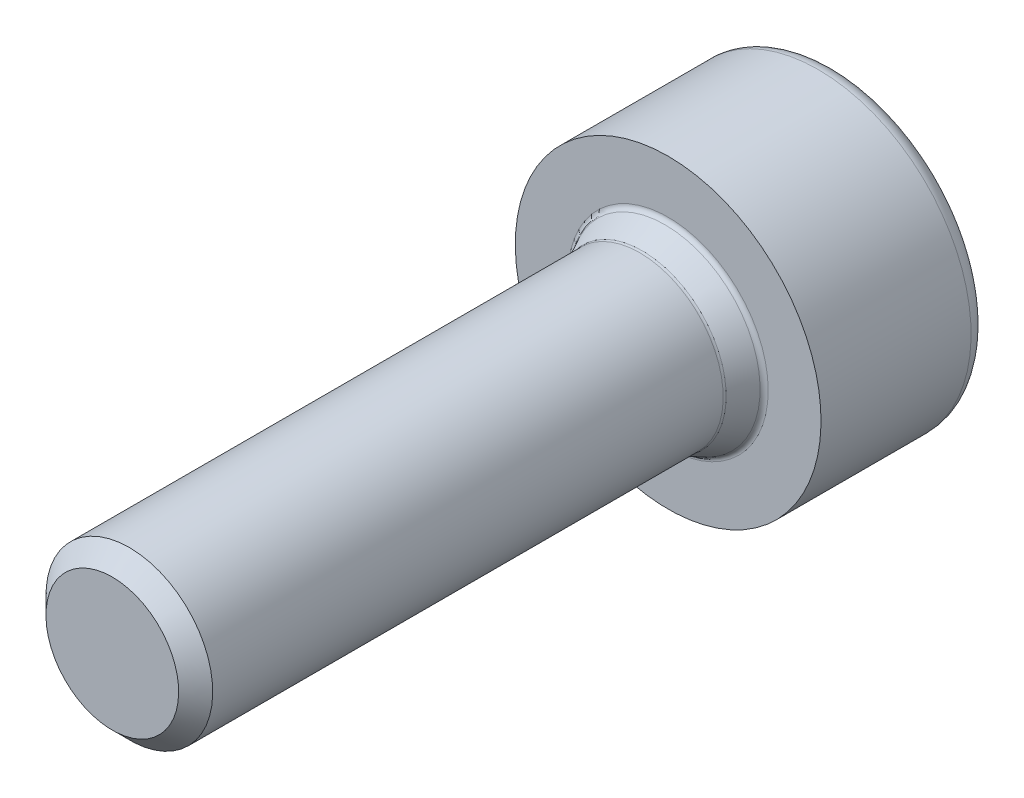
ISO-10303-21;
HEADER;
FILE_DESCRIPTION(('STEP AP214'),'2;1');
FILE_NAME('part.step','',(''),(''),'','','');
FILE_SCHEMA(('AUTOMOTIVE_DESIGN { 1 0 10303 214 1 1 1 1 }'));
ENDSEC;
DATA;
#1=APPLICATION_CONTEXT('core data for automotive mechanical design processes');
#2=APPLICATION_PROTOCOL_DEFINITION('international standard','automotive_design',2000,#1);
#3=PRODUCT_CONTEXT('',#1,'mechanical');
#4=PRODUCT('Part','Part','',(#3));
#5=PRODUCT_RELATED_PRODUCT_CATEGORY('part','',(#4));
#6=PRODUCT_DEFINITION_FORMATION('','',#4);
#7=PRODUCT_DEFINITION_CONTEXT('part definition',#1,'design');
#8=PRODUCT_DEFINITION('design','',#6,#7);
#9=PRODUCT_DEFINITION_SHAPE('','',#8);
#10=(LENGTH_UNIT() NAMED_UNIT(*) SI_UNIT(.MILLI.,.METRE.));
#11=(NAMED_UNIT(*) PLANE_ANGLE_UNIT() SI_UNIT($,.RADIAN.));
#12=(NAMED_UNIT(*) SI_UNIT($,.STERADIAN.) SOLID_ANGLE_UNIT());
#13=UNCERTAINTY_MEASURE_WITH_UNIT(LENGTH_MEASURE(1.E-05),#10,'distance_accuracy_value','');
#14=(GEOMETRIC_REPRESENTATION_CONTEXT(3) GLOBAL_UNCERTAINTY_ASSIGNED_CONTEXT((#13)) GLOBAL_UNIT_ASSIGNED_CONTEXT((#10,
#11,#12)) REPRESENTATION_CONTEXT('',''));
#15=CARTESIAN_POINT('',(0.,0.,0.));
#16=DIRECTION('',(0.,0.,1.));
#17=DIRECTION('',(1.,0.,0.));
#18=AXIS2_PLACEMENT_3D('',#15,#16,#17);
#19=CARTESIAN_POINT('',(-275.09203088991,679.314830971587,-405.507743681072));
#20=DIRECTION('',(0.,0.,1.));
#21=DIRECTION('',(1.,0.,0.));
#22=AXIS2_PLACEMENT_3D('',#19,#20,#21);
#23=PLANE('',#22);
#24=DIRECTION('',(0.,1.,0.));
#25=VECTOR('',#24,1.);
#26=CARTESIAN_POINT('',(-273.84203088991,678.5931431351,-405.507743681072));
#27=LINE('',#26,#25);
#28=CARTESIAN_POINT('',(-273.842030890129,679.314830971587,-405.507743681448));
#29=VERTEX_POINT('',#28);
#30=CARTESIAN_POINT('',(-273.84203088991,678.5931431351,-405.507743681072));
#31=VERTEX_POINT('',#30);
#32=EDGE_CURVE('E162',#29,#31,#27,.F.);
#33=ORIENTED_EDGE('',*,*,#32,.T.);
#34=DIRECTION('',(0.866025403784439,0.499999999999999,0.));
#35=VECTOR('',#34,1.);
#36=CARTESIAN_POINT('',(-275.09203088991,677.871455298613,-405.507743681072));
#37=LINE('',#36,#35);
#38=CARTESIAN_POINT('',(-274.467030890019,678.232299217046,-405.507743681448));
#39=VERTEX_POINT('',#38);
#40=EDGE_CURVE('E158',#31,#39,#37,.F.);
#41=ORIENTED_EDGE('',*,*,#40,.T.);
#42=CARTESIAN_POINT('',(-275.09203088991,679.314830971587,-405.507743681824));
#43=DIRECTION('',(0.,-1.99840144502376E-13,-1.));
#44=DIRECTION('',(0.,1.,-1.99840144502376E-13));
#45=AXIS2_PLACEMENT_3D('',#42,#43,#44);
#46=CIRCLE('',#45,1.24999999956307);
#47=EDGE_CURVE('E159',#39,#29,#46,.F.);
#48=ORIENTED_EDGE('',*,*,#47,.T.);
#49=EDGE_LOOP('',(#33,#41,#48));
#50=FACE_BOUND('',#49,.T.);
#51=ADVANCED_FACE('F17',(#50),#23,.F.);
#52=CARTESIAN_POINT('',(-275.09203088991,679.314830971587,-405.507743681072));
#53=DIRECTION('',(0.,0.,1.));
#54=DIRECTION('',(1.,0.,0.));
#55=AXIS2_PLACEMENT_3D('',#52,#53,#54);
#56=PLANE('',#55);
#57=DIRECTION('',(-0.866025403784438,0.500000000000001,0.));
#58=VECTOR('',#57,1.);
#59=CARTESIAN_POINT('',(-273.84203088991,680.036518808074,-405.507743681072));
#60=LINE('',#59,#58);
#61=CARTESIAN_POINT('',(-274.467030890019,680.397362726128,-405.507743681448));
#62=VERTEX_POINT('',#61);
#63=CARTESIAN_POINT('',(-273.84203088991,680.036518808074,-405.507743681072));
#64=VERTEX_POINT('',#63);
#65=EDGE_CURVE('E526',#62,#64,#60,.F.);
#66=ORIENTED_EDGE('',*,*,#65,.T.);
#67=DIRECTION('',(0.,1.,0.));
#68=VECTOR('',#67,1.);
#69=CARTESIAN_POINT('',(-273.84203088991,678.5931431351,-405.507743681072));
#70=LINE('',#69,#68);
#71=EDGE_CURVE('E554',#64,#29,#70,.F.);
#72=ORIENTED_EDGE('',*,*,#71,.T.);
#73=CARTESIAN_POINT('',(-275.09203088991,679.314830971587,-405.507743681824));
#74=DIRECTION('',(0.,-1.99840144502376E-13,-1.));
#75=DIRECTION('',(0.,1.,-1.99840144502376E-13));
#76=AXIS2_PLACEMENT_3D('',#73,#74,#75);
#77=CIRCLE('',#76,1.24999999956316);
#78=EDGE_CURVE('E177',#62,#29,#77,.T.);
#79=ORIENTED_EDGE('',*,*,#78,.F.);
#80=EDGE_LOOP('',(#66,#72,#79));
#81=FACE_BOUND('',#80,.T.);
#82=ADVANCED_FACE('F752',(#81),#56,.F.);
#83=CARTESIAN_POINT('',(-273.84203088991,678.5931431351,-405.507743681072));
#84=DIRECTION('',(1.,0.,0.));
#85=DIRECTION('',(0.,0.,-1.));
#86=AXIS2_PLACEMENT_3D('',#83,#84,#85);
#87=PLANE('',#86);
#88=DIRECTION('',(0.,1.,0.));
#89=VECTOR('',#88,1.);
#90=CARTESIAN_POINT('',(-273.84203088991,678.5931431351,-407.357743681072));
#91=LINE('',#90,#89);
#92=CARTESIAN_POINT('',(-273.84203088991,678.5931431351,-407.357743681072));
#93=VERTEX_POINT('',#92);
#94=CARTESIAN_POINT('',(-273.84203088991,678.610043769767,-407.35774368113));
#95=VERTEX_POINT('',#94);
#96=EDGE_CURVE('E426',#93,#95,#91,.T.);
#97=ORIENTED_EDGE('',*,*,#96,.F.);
#98=DIRECTION('',(0.,0.,1.));
#99=VECTOR('',#98,1.);
#100=CARTESIAN_POINT('',(-273.84203088991,678.5931431351,-405.507743681072));
#101=LINE('',#100,#99);
#102=EDGE_CURVE('E167',#93,#31,#101,.T.);
#103=ORIENTED_EDGE('',*,*,#102,.T.);
#104=ORIENTED_EDGE('',*,*,#32,.F.);
#105=ORIENTED_EDGE('',*,*,#71,.F.);
#106=DIRECTION('',(0.,0.,1.));
#107=VECTOR('',#106,1.);
#108=CARTESIAN_POINT('',(-273.84203088991,680.036518808074,-405.507743681072));
#109=LINE('',#108,#107);
#110=CARTESIAN_POINT('',(-273.84203088991,680.036518808074,-407.357743681072));
#111=VERTEX_POINT('',#110);
#112=EDGE_CURVE('E516',#64,#111,#109,.F.);
#113=ORIENTED_EDGE('',*,*,#112,.T.);
#114=DIRECTION('',(0.,1.,0.));
#115=VECTOR('',#114,1.);
#116=CARTESIAN_POINT('',(-273.84203088991,678.5931431351,-407.357743681072));
#117=LINE('',#116,#115);
#118=CARTESIAN_POINT('',(-273.84203088991,680.019618173502,-407.357743681177));
#119=VERTEX_POINT('',#118);
#120=EDGE_CURVE('E180',#119,#111,#117,.T.);
#121=ORIENTED_EDGE('',*,*,#120,.F.);
#122=CARTESIAN_POINT('',(-273.842030889891,678.61004376969,-407.357743681158));
#123=CARTESIAN_POINT('',(-273.842030889903,678.658367351189,-407.334028895814));
#124=CARTESIAN_POINT('',(-273.842030889908,678.707484359012,-407.311738212772));
#125=CARTESIAN_POINT('',(-273.842030889912,678.807601912463,-407.270951862234));
#126=CARTESIAN_POINT('',(-273.842030889911,678.858612037213,-407.252479912255));
#127=CARTESIAN_POINT('',(-273.842030889909,678.962032609969,-407.220650670239));
#128=CARTESIAN_POINT('',(-273.84203088991,679.014437012452,-407.207274243442));
#129=CARTESIAN_POINT('',(-273.84203088991,679.120343529249,-407.186723959786));
#130=CARTESIAN_POINT('',(-273.84203088991,679.173841949034,-407.179531920765));
#131=CARTESIAN_POINT('',(-273.84203088991,679.242074248191,-407.174774469127));
#132=CARTESIAN_POINT('',(-273.84203088991,679.256618367858,-407.174013782605));
#133=CARTESIAN_POINT('',(-273.84203088991,679.285717974129,-407.172998266324));
#134=CARTESIAN_POINT('',(-273.84203088991,679.300273452577,-407.172743207109));
#135=CARTESIAN_POINT('',(-273.84203088991,679.352768759238,-407.172744915631));
#136=CARTESIAN_POINT('',(-273.84203088991,679.390720405481,-407.174481617025));
#137=CARTESIAN_POINT('',(-273.84203088991,679.466327557936,-407.18132532491));
#138=CARTESIAN_POINT('',(-273.84203088991,679.503982836424,-407.186434707401));
#139=CARTESIAN_POINT('',(-273.84203088991,679.616430943837,-407.20649914869));
#140=CARTESIAN_POINT('',(-273.84203088991,679.69040544569,-407.226187273832));
#141=CARTESIAN_POINT('',(-273.84203088991,679.806892514054,-407.265452883154));
#142=CARTESIAN_POINT('',(-273.84203088991,679.850469864667,-407.282105843051));
#143=CARTESIAN_POINT('',(-273.84203088991,679.936075572493,-407.318082760439));
#144=CARTESIAN_POINT('',(-273.84203088991,679.978114014574,-407.33738256557));
#145=CARTESIAN_POINT('',(-273.84203088991,680.019618173481,-407.357743681167));
#146=B_SPLINE_CURVE_WITH_KNOTS('',3,(#122,#123,#124,#125,#126,#127,#128,#129,#130,#131,#132,
#133,#134,#135,#136,#137,#138,#139,#140,#141,#142,#143,#144,#145),.UNSPECIFIED.,.F.,.F.,(4,2,2,
2,2,2,2,2,2,2,2,4),(0.,0.161592976220646,0.32416127522541,0.486112932565553,0.647586806326945,
0.691272786615434,0.734938937488603,0.848735605602637,0.962612527338158,1.19125625199675,
1.33113310616139,1.4698093784729),.UNSPECIFIED.);
#147=EDGE_CURVE('E421',#95,#119,#146,.T.);
#148=ORIENTED_EDGE('',*,*,#147,.F.);
#149=EDGE_LOOP('',(#97,#103,#104,#105,#113,#121,#148));
#150=FACE_BOUND('',#149,.T.);
#151=ADVANCED_FACE('F412',(#150),#87,.F.);
#152=CARTESIAN_POINT('',(-275.09203088991,677.871455298613,-405.507743681072));
#153=DIRECTION('',(0.499999999999999,-0.866025403784439,0.));
#154=DIRECTION('',(0.866025403784439,0.499999999999999,0.));
#155=AXIS2_PLACEMENT_3D('',#152,#153,#154);
#156=PLANE('',#155);
#157=DIRECTION('',(0.,0.,1.));
#158=VECTOR('',#157,1.);
#159=CARTESIAN_POINT('',(-275.09203088991,677.871455298613,-405.507743681072));
#160=LINE('',#159,#158);
#161=CARTESIAN_POINT('',(-275.09203088991,677.871455298613,-407.357743681072));
#162=VERTEX_POINT('',#161);
#163=CARTESIAN_POINT('',(-275.09203088991,677.871455298613,-405.507743681072));
#164=VERTEX_POINT('',#163);
#165=EDGE_CURVE('E172',#162,#164,#160,.T.);
#166=ORIENTED_EDGE('',*,*,#165,.T.);
#167=DIRECTION('',(0.866025403784155,0.50000000000049,0.));
#168=VECTOR('',#167,1.);
#169=CARTESIAN_POINT('',(-275.09203088991,677.871455298613,-405.507743681072));
#170=LINE('',#169,#168);
#171=EDGE_CURVE('E146',#164,#39,#170,.T.);
#172=ORIENTED_EDGE('',*,*,#171,.T.);
#173=ORIENTED_EDGE('',*,*,#40,.F.);
#174=ORIENTED_EDGE('',*,*,#102,.F.);
#175=DIRECTION('',(0.866025403784439,0.499999999999999,0.));
#176=VECTOR('',#175,1.);
#177=CARTESIAN_POINT('',(-275.09203088991,677.871455298613,-407.357743681072));
#178=LINE('',#177,#176);
#179=CARTESIAN_POINT('',(-273.856667268789,678.584692817814,-407.357743681177));
#180=VERTEX_POINT('',#179);
#181=EDGE_CURVE('E420',#180,#93,#178,.T.);
#182=ORIENTED_EDGE('',*,*,#181,.F.);
#183=CARTESIAN_POINT('',(-275.077394511005,677.879905615892,-407.357743681157));
#184=CARTESIAN_POINT('',(-275.035545061831,677.904067406652,-407.334028895813));
#185=CARTESIAN_POINT('',(-274.9930084853,677.928625910568,-407.311738212771));
#186=CARTESIAN_POINT('',(-274.906304140647,677.978684687298,-407.270951862232));
#187=CARTESIAN_POINT('',(-274.862128076763,678.004189749672,-407.252479912254));
#188=CARTESIAN_POINT('',(-274.772563233482,678.055900036048,-407.220650670238));
#189=CARTESIAN_POINT('',(-274.727179689661,678.08210223729,-407.20727424344));
#190=CARTESIAN_POINT('',(-274.635461955692,678.135055495689,-407.186723959786));
#191=CARTESIAN_POINT('',(-274.589130965096,678.161804705583,-407.179531920766));
#192=CARTESIAN_POINT('',(-274.530040060667,678.195920855158,-407.174774469127));
#193=CARTESIAN_POINT('',(-274.517444483559,678.20319291499,-407.174013782604));
#194=CARTESIAN_POINT('',(-274.49224348529,678.217742718129,-407.172998266324));
#195=CARTESIAN_POINT('',(-274.479638071192,678.225020457357,-407.172743207111));
#196=CARTESIAN_POINT('',(-274.434175802048,678.251268110695,-407.172744915636));
#197=CARTESIAN_POINT('',(-274.40130871228,678.270243933807,-407.174481617026));
#198=CARTESIAN_POINT('',(-274.335830997542,678.308047510028,-407.181325324908));
#199=CARTESIAN_POINT('',(-274.303220569786,678.326875149274,-407.1864347074));
#200=CARTESIAN_POINT('',(-274.205837652162,678.383099202984,-407.206499148691));
#201=CARTESIAN_POINT('',(-274.141773854324,678.420086453909,-407.226187273832));
#202=CARTESIAN_POINT('',(-274.040893093908,678.47832998809,-407.265452883154));
#203=CARTESIAN_POINT('',(-274.003154001248,678.500118663396,-407.282105843051));
#204=CARTESIAN_POINT('',(-273.929017283561,678.54292151731,-407.318082760438));
#205=CARTESIAN_POINT('',(-273.892610924784,678.56394073835,-407.33738256557));
#206=CARTESIAN_POINT('',(-273.856667268808,678.584692817804,-407.357743681167));
#207=B_SPLINE_CURVE_WITH_KNOTS('',3,(#183,#184,#185,#186,#187,#188,#189,#190,#191,#192,#193,
#194,#195,#196,#197,#198,#199,#200,#201,#202,#203,#204,#205,#206),.UNSPECIFIED.,.F.,.F.,(4,2,2,
2,2,2,2,2,2,2,2,4),(0.,0.161592976223518,0.32416127523001,0.486112932567606,0.647586806327025,
0.691272786615723,0.734938937489251,0.84873560560415,0.962612527339508,1.19125625199705,
1.33113310616115,1.46980937847321),.UNSPECIFIED.);
#208=CARTESIAN_POINT('',(-275.077394510948,677.879905615946,-407.35774368113));
#209=VERTEX_POINT('',#208);
#210=EDGE_CURVE('E415',#209,#180,#207,.T.);
#211=ORIENTED_EDGE('',*,*,#210,.F.);
#212=DIRECTION('',(0.866025403784439,0.499999999999999,0.));
#213=VECTOR('',#212,1.);
#214=CARTESIAN_POINT('',(-275.09203088991,677.871455298613,-407.357743681072));
#215=LINE('',#214,#213);
#216=EDGE_CURVE('E166',#162,#209,#215,.T.);
#217=ORIENTED_EDGE('',*,*,#216,.F.);
#218=EDGE_LOOP('',(#166,#172,#173,#174,#182,#211,#217));
#219=FACE_BOUND('',#218,.T.);
#220=ADVANCED_FACE('F169',(#219),#156,.F.);
#221=CARTESIAN_POINT('',(-275.09203088991,679.314830971587,-405.507743681072));
#222=DIRECTION('',(0.,0.,1.));
#223=DIRECTION('',(1.,0.,0.));
#224=AXIS2_PLACEMENT_3D('',#221,#222,#223);
#225=PLANE('',#224);
#226=ORIENTED_EDGE('',*,*,#171,.F.);
#227=DIRECTION('',(0.866025403784438,-0.500000000000001,0.));
#228=VECTOR('',#227,1.);
#229=CARTESIAN_POINT('',(-276.34203088991,678.5931431351,-405.507743681072));
#230=LINE('',#229,#228);
#231=CARTESIAN_POINT('',(-275.717030889801,678.232299217046,-405.507743681448));
#232=VERTEX_POINT('',#231);
#233=EDGE_CURVE('E148',#164,#232,#230,.F.);
#234=ORIENTED_EDGE('',*,*,#233,.T.);
#235=CARTESIAN_POINT('',(-275.09203088991,679.314830971587,-405.507743681824));
#236=DIRECTION('',(0.,-1.99840144502376E-13,-1.));
#237=DIRECTION('',(0.,1.,-1.99840144502376E-13));
#238=AXIS2_PLACEMENT_3D('',#235,#236,#237);
#239=CIRCLE('',#238,1.24999999956307);
#240=EDGE_CURVE('E142',#232,#39,#239,.F.);
#241=ORIENTED_EDGE('',*,*,#240,.T.);
#242=EDGE_LOOP('',(#226,#234,#241));
#243=FACE_BOUND('',#242,.T.);
#244=ADVANCED_FACE('F144',(#243),#225,.F.);
#245=CARTESIAN_POINT('',(-275.09203088991,679.314830971587,-405.507743681824));
#246=DIRECTION('',(0.,-1.99840144502376E-13,-1.));
#247=DIRECTION('',(0.,1.,-1.99840144502376E-13));
#248=AXIS2_PLACEMENT_3D('',#245,#246,#247);
#249=CONICAL_SURFACE('',#248,1.2499999995631,1.04719755000089);
#250=CARTESIAN_POINT('',(-275.09203088991,679.314830971587,-405.507743681824));
#251=DIRECTION('',(0.,-1.99840144502376E-13,-1.));
#252=DIRECTION('',(0.,1.,-1.99840144502376E-13));
#253=AXIS2_PLACEMENT_3D('',#250,#251,#252);
#254=CIRCLE('',#253,1.2499999995631);
#255=CARTESIAN_POINT('',(-275.717030889801,680.397362726128,-405.507743681448));
#256=VERTEX_POINT('',#255);
#257=EDGE_CURVE('E153',#256,#62,#254,.T.);
#258=ORIENTED_EDGE('',*,*,#257,.T.);
#259=ORIENTED_EDGE('',*,*,#78,.T.);
#260=ORIENTED_EDGE('',*,*,#47,.F.);
#261=ORIENTED_EDGE('',*,*,#240,.F.);
#262=CARTESIAN_POINT('',(-275.09203088991,679.314830971587,-405.507743681824));
#263=DIRECTION('',(0.,-1.99840144502376E-13,-1.));
#264=DIRECTION('',(0.,1.,-1.99840144502376E-13));
#265=AXIS2_PLACEMENT_3D('',#262,#263,#264);
#266=CIRCLE('',#265,1.2499999995631);
#267=CARTESIAN_POINT('',(-276.342030889692,679.314830971587,-405.507743681448));
#268=VERTEX_POINT('',#267);
#269=EDGE_CURVE('E380',#232,#268,#266,.T.);
#270=ORIENTED_EDGE('',*,*,#269,.T.);
#271=CARTESIAN_POINT('',(-275.09203088991,679.314830971587,-405.507743681824));
#272=DIRECTION('',(0.,-1.99840144502376E-13,-1.));
#273=DIRECTION('',(0.,1.,-1.99840144502376E-13));
#274=AXIS2_PLACEMENT_3D('',#271,#272,#273);
#275=CIRCLE('',#274,1.24999999956314);
#276=EDGE_CURVE('E789',#268,#256,#275,.T.);
#277=ORIENTED_EDGE('',*,*,#276,.T.);
#278=EDGE_LOOP('',(#258,#259,#260,#261,#270,#277));
#279=FACE_BOUND('',#278,.T.);
#280=CARTESIAN_POINT('',(-275.09203088991,679.314830971691,-404.786055843601));
#281=VERTEX_POINT('',#280);
#282=VERTEX_LOOP('',#281);
#283=FACE_BOUND('',#282,.T.);
#284=ADVANCED_FACE('F174',(#279,#283),#249,.F.);
#285=CARTESIAN_POINT('',(-275.09203088991,679.314830971587,-405.507743681072));
#286=DIRECTION('',(0.,0.,1.));
#287=DIRECTION('',(1.,0.,0.));
#288=AXIS2_PLACEMENT_3D('',#285,#286,#287);
#289=PLANE('',#288);
#290=DIRECTION('',(-0.866025403784439,-0.499999999999999,0.));
#291=VECTOR('',#290,1.);
#292=CARTESIAN_POINT('',(-275.09203088991,680.758206644561,-405.507743681072));
#293=LINE('',#292,#291);
#294=CARTESIAN_POINT('',(-275.09203088991,680.758206644561,-405.507743681072));
#295=VERTEX_POINT('',#294);
#296=EDGE_CURVE('E511',#256,#295,#293,.F.);
#297=ORIENTED_EDGE('',*,*,#296,.T.);
#298=DIRECTION('',(-0.866025403784438,0.500000000000001,0.));
#299=VECTOR('',#298,1.);
#300=CARTESIAN_POINT('',(-273.84203088991,680.036518808074,-405.507743681072));
#301=LINE('',#300,#299);
#302=EDGE_CURVE('E521',#295,#62,#301,.F.);
#303=ORIENTED_EDGE('',*,*,#302,.T.);
#304=ORIENTED_EDGE('',*,*,#257,.F.);
#305=EDGE_LOOP('',(#297,#303,#304));
#306=FACE_BOUND('',#305,.T.);
#307=ADVANCED_FACE('F400',(#306),#289,.F.);
#308=CARTESIAN_POINT('',(-273.84203088991,680.036518808074,-405.507743681072));
#309=DIRECTION('',(0.500000000000001,0.866025403784438,0.));
#310=DIRECTION('',(-0.866025403784438,0.500000000000001,0.));
#311=AXIS2_PLACEMENT_3D('',#308,#309,#310);
#312=PLANE('',#311);
#313=ORIENTED_EDGE('',*,*,#112,.F.);
#314=ORIENTED_EDGE('',*,*,#65,.F.);
#315=ORIENTED_EDGE('',*,*,#302,.F.);
#316=DIRECTION('',(0.,0.,1.));
#317=VECTOR('',#316,1.);
#318=CARTESIAN_POINT('',(-275.09203088991,680.758206644561,-405.507743681072));
#319=LINE('',#318,#317);
#320=CARTESIAN_POINT('',(-275.09203088991,680.758206644561,-407.357743681072));
#321=VERTEX_POINT('',#320);
#322=EDGE_CURVE('E507',#295,#321,#319,.F.);
#323=ORIENTED_EDGE('',*,*,#322,.T.);
#324=DIRECTION('',(-0.866025403784438,0.500000000000001,0.));
#325=VECTOR('',#324,1.);
#326=CARTESIAN_POINT('',(-273.84203088991,680.036518808074,-407.357743681072));
#327=LINE('',#326,#325);
#328=CARTESIAN_POINT('',(-275.077394511031,680.749756327275,-407.357743681178));
#329=VERTEX_POINT('',#328);
#330=EDGE_CURVE('E519',#329,#321,#327,.T.);
#331=ORIENTED_EDGE('',*,*,#330,.F.);
#332=CARTESIAN_POINT('',(-273.856667268796,680.044969125386,-407.357743681158));
#333=CARTESIAN_POINT('',(-273.898516717982,680.069130916125,-407.334028895814));
#334=CARTESIAN_POINT('',(-273.941053294518,680.093689420033,-407.311738212772));
#335=CARTESIAN_POINT('',(-274.027757639175,680.143748196756,-407.270951862233));
#336=CARTESIAN_POINT('',(-274.071933703058,680.169253259132,-407.252479912254));
#337=CARTESIAN_POINT('',(-274.161498546338,680.220963545511,-407.220650670238));
#338=CARTESIAN_POINT('',(-274.206882090158,680.247165746752,-407.207274243441));
#339=CARTESIAN_POINT('',(-274.298599824129,680.300119005148,-407.186723959787));
#340=CARTESIAN_POINT('',(-274.344930814726,680.326868215039,-407.179531920766));
#341=CARTESIAN_POINT('',(-274.404021719153,680.36098436462,-407.174774469127));
#342=CARTESIAN_POINT('',(-274.416617296259,680.368256424455,-407.174013782605));
#343=CARTESIAN_POINT('',(-274.441818294532,680.382806227587,-407.172998266325));
#344=CARTESIAN_POINT('',(-274.454423708634,680.390083966807,-407.172743207112));
#345=CARTESIAN_POINT('',(-274.499885977787,680.41633162013,-407.172744915637));
#346=CARTESIAN_POINT('',(-274.532753067544,680.435307443261,-407.174481617027));
#347=CARTESIAN_POINT('',(-274.598230782274,680.473111019496,-407.181325324908));
#348=CARTESIAN_POINT('',(-274.630841210032,680.491938658738,-407.1864347074));
#349=CARTESIAN_POINT('',(-274.728224127661,680.54816271244,-407.206499148692));
#350=CARTESIAN_POINT('',(-274.792287925497,680.585149963369,-407.226187273832));
#351=CARTESIAN_POINT('',(-274.893168685912,680.643393497552,-407.265452883154));
#352=CARTESIAN_POINT('',(-274.930907778572,680.665182172857,-407.282105843052));
#353=CARTESIAN_POINT('',(-275.005044496259,680.70798502677,-407.318082760439));
#354=CARTESIAN_POINT('',(-275.041450855036,680.729004247811,-407.33738256557));
#355=CARTESIAN_POINT('',(-275.077394511012,680.749756327264,-407.357743681167));
#356=B_SPLINE_CURVE_WITH_KNOTS('',3,(#332,#333,#334,#335,#336,#337,#338,#339,#340,#341,#342,
#343,#344,#345,#346,#347,#348,#349,#350,#351,#352,#353,#354,#355),.UNSPECIFIED.,.F.,.F.,(4,2,2,
2,2,2,2,2,2,2,2,4),(0.,0.161592976223579,0.324161275229973,0.486112932567475,0.647586806326902,
0.691272786615549,0.734938937489053,0.848735605603976,0.962612527339176,1.19125625199676,
1.33113310616087,1.46980937847286),.UNSPECIFIED.);
#357=CARTESIAN_POINT('',(-273.856667268872,680.044969125408,-407.35774368113));
#358=VERTEX_POINT('',#357);
#359=EDGE_CURVE('E381',#358,#329,#356,.T.);
#360=ORIENTED_EDGE('',*,*,#359,.F.);
#361=DIRECTION('',(-0.866025403784438,0.500000000000001,0.));
#362=VECTOR('',#361,1.);
#363=CARTESIAN_POINT('',(-273.84203088991,680.036518808074,-407.357743681072));
#364=LINE('',#363,#362);
#365=EDGE_CURVE('E379',#111,#358,#364,.T.);
#366=ORIENTED_EDGE('',*,*,#365,.F.);
#367=EDGE_LOOP('',(#313,#314,#315,#323,#331,#360,#366));
#368=FACE_BOUND('',#367,.T.);
#369=ADVANCED_FACE('F394',(#368),#312,.F.);
#370=CARTESIAN_POINT('',(-276.34203088991,678.5931431351,-405.507743681072));
#371=DIRECTION('',(-0.500000000000001,-0.866025403784438,0.));
#372=DIRECTION('',(0.866025403784438,-0.500000000000001,0.));
#373=AXIS2_PLACEMENT_3D('',#370,#371,#372);
#374=PLANE('',#373);
#375=DIRECTION('',(0.,0.,1.));
#376=VECTOR('',#375,1.);
#377=CARTESIAN_POINT('',(-276.34203088991,678.5931431351,-405.507743681072));
#378=LINE('',#377,#376);
#379=CARTESIAN_POINT('',(-276.34203088991,678.5931431351,-407.357743681072));
#380=VERTEX_POINT('',#379);
#381=CARTESIAN_POINT('',(-276.34203088991,678.5931431351,-405.507743681072));
#382=VERTEX_POINT('',#381);
#383=EDGE_CURVE('E798',#380,#382,#378,.T.);
#384=ORIENTED_EDGE('',*,*,#383,.T.);
#385=DIRECTION('',(0.866025403784755,-0.499999999999452,0.));
#386=VECTOR('',#385,1.);
#387=CARTESIAN_POINT('',(-276.34203088991,678.5931431351,-405.507743681072));
#388=LINE('',#387,#386);
#389=EDGE_CURVE('E819',#382,#232,#388,.T.);
#390=ORIENTED_EDGE('',*,*,#389,.T.);
#391=ORIENTED_EDGE('',*,*,#233,.F.);
#392=ORIENTED_EDGE('',*,*,#165,.F.);
#393=DIRECTION('',(0.866025403784438,-0.500000000000001,0.));
#394=VECTOR('',#393,1.);
#395=CARTESIAN_POINT('',(-276.34203088991,678.5931431351,-407.357743681072));
#396=LINE('',#395,#394);
#397=CARTESIAN_POINT('',(-275.106667268789,677.879905615899,-407.357743681177));
#398=VERTEX_POINT('',#397);
#399=EDGE_CURVE('E378',#398,#162,#396,.T.);
#400=ORIENTED_EDGE('',*,*,#399,.F.);
#401=CARTESIAN_POINT('',(-276.327394511025,678.584692817788,-407.357743681158));
#402=CARTESIAN_POINT('',(-276.285545061838,678.560531027049,-407.334028895814));
#403=CARTESIAN_POINT('',(-276.243008485302,678.535972523141,-407.311738212771));
#404=CARTESIAN_POINT('',(-276.156304140645,678.485913746418,-407.270951862232));
#405=CARTESIAN_POINT('',(-276.112128076762,678.460408684042,-407.252479912254));
#406=CARTESIAN_POINT('',(-276.022563233482,678.408698397663,-407.220650670238));
#407=CARTESIAN_POINT('',(-275.977179689662,678.382496196422,-407.207274243441));
#408=CARTESIAN_POINT('',(-275.885461955691,678.329542938026,-407.186723959786));
#409=CARTESIAN_POINT('',(-275.839130965093,678.302793728135,-407.179531920766));
#410=CARTESIAN_POINT('',(-275.780040060667,678.268677578554,-407.174774469127));
#411=CARTESIAN_POINT('',(-275.767444483561,678.261405518719,-407.174013782604));
#412=CARTESIAN_POINT('',(-275.742243485288,678.246855715587,-407.172998266324));
#413=CARTESIAN_POINT('',(-275.729638071186,678.239577976367,-407.172743207111));
#414=CARTESIAN_POINT('',(-275.684175802034,678.213330323044,-407.172744915637));
#415=CARTESIAN_POINT('',(-275.651308712277,678.194354499913,-407.174481617026));
#416=CARTESIAN_POINT('',(-275.585830997546,678.156550923678,-407.181325324908));
#417=CARTESIAN_POINT('',(-275.553220569788,678.137723284436,-407.1864347074));
#418=CARTESIAN_POINT('',(-275.455837652159,678.081499230734,-407.206499148691));
#419=CARTESIAN_POINT('',(-275.391773854324,678.044511979806,-407.226187273832));
#420=CARTESIAN_POINT('',(-275.290893093908,677.986268445622,-407.265452883153));
#421=CARTESIAN_POINT('',(-275.253154001248,677.964479770316,-407.282105843051));
#422=CARTESIAN_POINT('',(-275.179017283561,677.921676916403,-407.318082760438));
#423=CARTESIAN_POINT('',(-275.142610924784,677.900657695363,-407.33738256557));
#424=CARTESIAN_POINT('',(-275.106667268808,677.879905615909,-407.357743681166));
#425=B_SPLINE_CURVE_WITH_KNOTS('',3,(#401,#402,#403,#404,#405,#406,#407,#408,#409,#410,#411,
#412,#413,#414,#415,#416,#417,#418,#419,#420,#421,#422,#423,#424),.UNSPECIFIED.,.F.,.F.,(4,2,2,
2,2,2,2,2,2,2,2,4),(0.,0.161592976223579,0.324161275230101,0.486112932567737,0.647586806327163,
0.691272786615462,0.734938937488726,0.848735605603639,0.962612527338982,1.19125625199649,
1.33113310616101,1.46980937847325),.UNSPECIFIED.);
#426=CARTESIAN_POINT('',(-276.327394510948,678.584692817766,-407.35774368113));
#427=VERTEX_POINT('',#426);
#428=EDGE_CURVE('E370',#427,#398,#425,.T.);
#429=ORIENTED_EDGE('',*,*,#428,.F.);
#430=DIRECTION('',(0.866025403784438,-0.500000000000001,0.));
#431=VECTOR('',#430,1.);
#432=CARTESIAN_POINT('',(-276.34203088991,678.5931431351,-407.357743681072));
#433=LINE('',#432,#431);
#434=EDGE_CURVE('E498',#380,#427,#433,.T.);
#435=ORIENTED_EDGE('',*,*,#434,.F.);
#436=EDGE_LOOP('',(#384,#390,#391,#392,#400,#429,#435));
#437=FACE_BOUND('',#436,.T.);
#438=ADVANCED_FACE('F389',(#437),#374,.F.);
#439=CARTESIAN_POINT('',(-275.09203088991,679.314830971587,-405.507743681072));
#440=DIRECTION('',(0.,0.,1.));
#441=DIRECTION('',(1.,0.,0.));
#442=AXIS2_PLACEMENT_3D('',#439,#440,#441);
#443=PLANE('',#442);
#444=ORIENTED_EDGE('',*,*,#389,.F.);
#445=DIRECTION('',(0.,1.,0.));
#446=VECTOR('',#445,1.);
#447=CARTESIAN_POINT('',(-276.34203088991,680.036518808074,-405.507743681072));
#448=LINE('',#447,#446);
#449=EDGE_CURVE('E812',#382,#268,#448,.T.);
#450=ORIENTED_EDGE('',*,*,#449,.T.);
#451=ORIENTED_EDGE('',*,*,#269,.F.);
#452=EDGE_LOOP('',(#444,#450,#451));
#453=FACE_BOUND('',#452,.T.);
#454=ADVANCED_FACE('F393',(#453),#443,.F.);
#455=CARTESIAN_POINT('',(-275.09203088991,679.314830971587,-405.507743681072));
#456=DIRECTION('',(0.,0.,1.));
#457=DIRECTION('',(1.,0.,0.));
#458=AXIS2_PLACEMENT_3D('',#455,#456,#457);
#459=PLANE('',#458);
#460=DIRECTION('',(0.,1.,0.));
#461=VECTOR('',#460,1.);
#462=CARTESIAN_POINT('',(-276.34203088991,680.036518808074,-405.507743681072));
#463=LINE('',#462,#461);
#464=CARTESIAN_POINT('',(-276.34203088991,680.036518808074,-405.507743681072));
#465=VERTEX_POINT('',#464);
#466=EDGE_CURVE('E337',#268,#465,#463,.T.);
#467=ORIENTED_EDGE('',*,*,#466,.T.);
#468=DIRECTION('',(-0.866025403784439,-0.499999999999999,0.));
#469=VECTOR('',#468,1.);
#470=CARTESIAN_POINT('',(-275.09203088991,680.758206644561,-405.507743681072));
#471=LINE('',#470,#469);
#472=EDGE_CURVE('E530',#465,#256,#471,.F.);
#473=ORIENTED_EDGE('',*,*,#472,.T.);
#474=ORIENTED_EDGE('',*,*,#276,.F.);
#475=EDGE_LOOP('',(#467,#473,#474));
#476=FACE_BOUND('',#475,.T.);
#477=ADVANCED_FACE('F700',(#476),#459,.F.);
#478=CARTESIAN_POINT('',(-275.09203088991,680.758206644561,-405.507743681072));
#479=DIRECTION('',(-0.499999999999999,0.866025403784439,0.));
#480=DIRECTION('',(-0.866025403784439,-0.499999999999999,0.));
#481=AXIS2_PLACEMENT_3D('',#478,#479,#480);
#482=PLANE('',#481);
#483=ORIENTED_EDGE('',*,*,#322,.F.);
#484=ORIENTED_EDGE('',*,*,#296,.F.);
#485=ORIENTED_EDGE('',*,*,#472,.F.);
#486=DIRECTION('',(0.,0.,1.));
#487=VECTOR('',#486,1.);
#488=CARTESIAN_POINT('',(-276.34203088991,680.036518808074,-405.507743681072));
#489=LINE('',#488,#487);
#490=CARTESIAN_POINT('',(-276.34203088991,680.036518808074,-407.357743681072));
#491=VERTEX_POINT('',#490);
#492=EDGE_CURVE('E331',#465,#491,#489,.F.);
#493=ORIENTED_EDGE('',*,*,#492,.T.);
#494=DIRECTION('',(-0.866025403784439,-0.499999999999999,0.));
#495=VECTOR('',#494,1.);
#496=CARTESIAN_POINT('',(-275.09203088991,680.758206644561,-407.357743681072));
#497=LINE('',#496,#495);
#498=CARTESIAN_POINT('',(-276.327394511031,680.04496912536,-407.357743681178));
#499=VERTEX_POINT('',#498);
#500=EDGE_CURVE('E804',#499,#491,#497,.T.);
#501=ORIENTED_EDGE('',*,*,#500,.F.);
#502=CARTESIAN_POINT('',(-275.106667268815,680.749756327283,-407.357743681158));
#503=CARTESIAN_POINT('',(-275.14851671799,680.725594536522,-407.334028895814));
#504=CARTESIAN_POINT('',(-275.19105329452,680.701036032606,-407.311738212772));
#505=CARTESIAN_POINT('',(-275.277757639173,680.650977255876,-407.270951862233));
#506=CARTESIAN_POINT('',(-275.321933703058,680.625472193502,-407.252479912254));
#507=CARTESIAN_POINT('',(-275.411498546338,680.573761907126,-407.220650670238));
#508=CARTESIAN_POINT('',(-275.456882090159,680.547559705884,-407.207274243441));
#509=CARTESIAN_POINT('',(-275.548599824128,680.494606447485,-407.186723959787));
#510=CARTESIAN_POINT('',(-275.594930814724,680.467857237591,-407.179531920766));
#511=CARTESIAN_POINT('',(-275.654021719153,680.433741088016,-407.174774469127));
#512=CARTESIAN_POINT('',(-275.666617296261,680.426469028184,-407.174013782605));
#513=CARTESIAN_POINT('',(-275.69181829453,680.411919225045,-407.172998266325));
#514=CARTESIAN_POINT('',(-275.704423708628,680.404641485817,-407.172743207112));
#515=CARTESIAN_POINT('',(-275.749885977772,680.378393832479,-407.172744915637));
#516=CARTESIAN_POINT('',(-275.782753067539,680.359418009367,-407.174481617027));
#517=CARTESIAN_POINT('',(-275.848230782278,680.321614433146,-407.181325324908));
#518=CARTESIAN_POINT('',(-275.880841210033,680.3027867939,-407.1864347074));
#519=CARTESIAN_POINT('',(-275.978224127658,680.24656274019,-407.206499148691));
#520=CARTESIAN_POINT('',(-276.042287925495,680.209575489266,-407.226187273832));
#521=CARTESIAN_POINT('',(-276.143168685912,680.151331955084,-407.265452883154));
#522=CARTESIAN_POINT('',(-276.180907778572,680.129543279778,-407.282105843051));
#523=CARTESIAN_POINT('',(-276.255044496258,680.086740425864,-407.318082760439));
#524=CARTESIAN_POINT('',(-276.291450855036,680.065721204824,-407.33738256557));
#525=CARTESIAN_POINT('',(-276.327394511012,680.044969125371,-407.357743681167));
#526=B_SPLINE_CURVE_WITH_KNOTS('',3,(#502,#503,#504,#505,#506,#507,#508,#509,#510,#511,#512,
#513,#514,#515,#516,#517,#518,#519,#520,#521,#522,#523,#524,#525),.UNSPECIFIED.,.F.,.F.,(4,2,2,
2,2,2,2,2,2,2,2,4),(0.,0.161592976223502,0.324161275229979,0.486112932567421,0.647586806326808,
0.691272786615255,0.734938937488584,0.848735605603326,0.962612527338669,1.19125625199618,
1.33113310616049,1.46980937847278),.UNSPECIFIED.);
#527=CARTESIAN_POINT('',(-275.106667268872,680.749756327227,-407.35774368113));
#528=VERTEX_POINT('',#527);
#529=EDGE_CURVE('E347',#528,#499,#526,.T.);
#530=ORIENTED_EDGE('',*,*,#529,.F.);
#531=DIRECTION('',(-0.866025403784439,-0.499999999999999,0.));
#532=VECTOR('',#531,1.);
#533=CARTESIAN_POINT('',(-275.09203088991,680.758206644561,-407.357743681072));
#534=LINE('',#533,#532);
#535=EDGE_CURVE('E510',#321,#528,#534,.T.);
#536=ORIENTED_EDGE('',*,*,#535,.F.);
#537=EDGE_LOOP('',(#483,#484,#485,#493,#501,#530,#536));
#538=FACE_BOUND('',#537,.T.);
#539=ADVANCED_FACE('F693',(#538),#482,.F.);
#540=CARTESIAN_POINT('',(-276.34203088991,680.036518808074,-405.507743681072));
#541=DIRECTION('',(-1.,0.,0.));
#542=DIRECTION('',(0.,0.,1.));
#543=AXIS2_PLACEMENT_3D('',#540,#541,#542);
#544=PLANE('',#543);
#545=ORIENTED_EDGE('',*,*,#492,.F.);
#546=ORIENTED_EDGE('',*,*,#466,.F.);
#547=ORIENTED_EDGE('',*,*,#449,.F.);
#548=ORIENTED_EDGE('',*,*,#383,.F.);
#549=DIRECTION('',(0.,1.,0.));
#550=VECTOR('',#549,1.);
#551=CARTESIAN_POINT('',(-276.34203088991,680.036518808074,-407.357743681072));
#552=LINE('',#551,#550);
#553=CARTESIAN_POINT('',(-276.34203088991,678.610043769767,-407.35774368113));
#554=VERTEX_POINT('',#553);
#555=EDGE_CURVE('E796',#554,#380,#552,.F.);
#556=ORIENTED_EDGE('',*,*,#555,.F.);
#557=CARTESIAN_POINT('',(-276.342030889932,678.610043769684,-407.357743681159));
#558=CARTESIAN_POINT('',(-276.342030889918,678.658367351184,-407.334028895816));
#559=CARTESIAN_POINT('',(-276.342030889912,678.707484359008,-407.311738212774));
#560=CARTESIAN_POINT('',(-276.342030889908,678.80760191246,-407.270951862235));
#561=CARTESIAN_POINT('',(-276.342030889909,678.85861203721,-407.252479912256));
#562=CARTESIAN_POINT('',(-276.342030889911,678.962032609966,-407.22065067024));
#563=CARTESIAN_POINT('',(-276.34203088991,679.01443701245,-407.207274243442));
#564=CARTESIAN_POINT('',(-276.34203088991,679.120343529248,-407.186723959786));
#565=CARTESIAN_POINT('',(-276.34203088991,679.173841949034,-407.179531920765));
#566=CARTESIAN_POINT('',(-276.34203088991,679.242074248191,-407.174774469127));
#567=CARTESIAN_POINT('',(-276.34203088991,679.256618367858,-407.174013782605));
#568=CARTESIAN_POINT('',(-276.34203088991,679.285717974129,-407.172998266324));
#569=CARTESIAN_POINT('',(-276.34203088991,679.300273452577,-407.172743207109));
#570=CARTESIAN_POINT('',(-276.34203088991,679.352768759238,-407.172744915631));
#571=CARTESIAN_POINT('',(-276.34203088991,679.390720405481,-407.174481617025));
#572=CARTESIAN_POINT('',(-276.34203088991,679.466327557936,-407.18132532491));
#573=CARTESIAN_POINT('',(-276.34203088991,679.503982836424,-407.1864347074));
#574=CARTESIAN_POINT('',(-276.34203088991,679.616430943837,-407.20649914869));
#575=CARTESIAN_POINT('',(-276.34203088991,679.69040544569,-407.226187273832));
#576=CARTESIAN_POINT('',(-276.34203088991,679.806892514055,-407.265452883154));
#577=CARTESIAN_POINT('',(-276.34203088991,679.850469864669,-407.282105843052));
#578=CARTESIAN_POINT('',(-276.34203088991,679.936075572497,-407.31808276044));
#579=CARTESIAN_POINT('',(-276.34203088991,679.978114014579,-407.337382565572));
#580=CARTESIAN_POINT('',(-276.34203088991,680.019618173486,-407.357743681169));
#581=B_SPLINE_CURVE_WITH_KNOTS('',3,(#557,#558,#559,#560,#561,#562,#563,#564,#565,#566,#567,
#568,#569,#570,#571,#572,#573,#574,#575,#576,#577,#578,#579,#580),.UNSPECIFIED.,.F.,.F.,(4,2,2,
2,2,2,2,2,2,2,2,4),(0.,0.161592976222253,0.324161275228429,0.486112932569999,0.647586806333078,
0.691272786621571,0.734938937494627,0.848735605608772,0.962612527344074,1.19125625200256,
1.33113310617044,1.46980937848499),.UNSPECIFIED.);
#582=CARTESIAN_POINT('',(-276.34203088991,680.019618173505,-407.357743681179));
#583=VERTEX_POINT('',#582);
#584=EDGE_CURVE('E324',#554,#583,#581,.T.);
#585=ORIENTED_EDGE('',*,*,#584,.T.);
#586=DIRECTION('',(0.,1.,0.));
#587=VECTOR('',#586,1.);
#588=CARTESIAN_POINT('',(-276.34203088991,677.372330971587,-407.357743681072));
#589=LINE('',#588,#587);
#590=EDGE_CURVE('E315',#491,#583,#589,.F.);
#591=ORIENTED_EDGE('',*,*,#590,.F.);
#592=EDGE_LOOP('',(#545,#546,#547,#548,#556,#585,#591));
#593=FACE_BOUND('',#592,.T.);
#594=ADVANCED_FACE('F354',(#593),#544,.F.);
#595=CARTESIAN_POINT('',(-275.09203088991,679.314830971587,-407.357743681075));
#596=DIRECTION('',(0.,-2.32102374503592E-13,-1.));
#597=DIRECTION('',(0.,1.,-2.32102374503592E-13));
#598=AXIS2_PLACEMENT_3D('',#595,#596,#597);
#599=CONICAL_SURFACE('',#598,1.43499999989183,0.785398162634025);
#600=CARTESIAN_POINT('',(-275.09203088991,679.314830971587,-407.357743681188));
#601=DIRECTION('',(0.,-2.32102374503592E-13,-1.));
#602=DIRECTION('',(0.,1.,-2.32102374503592E-13));
#603=AXIS2_PLACEMENT_3D('',#600,#601,#602);
#604=CIRCLE('',#603,1.43500000000552);
#605=EDGE_CURVE('E323',#583,#554,#604,.F.);
#606=ORIENTED_EDGE('',*,*,#605,.F.);
#607=ORIENTED_EDGE('',*,*,#584,.F.);
#608=EDGE_LOOP('',(#606,#607));
#609=FACE_BOUND('',#608,.T.);
#610=ADVANCED_FACE('F356',(#609),#599,.F.);
#611=CARTESIAN_POINT('',(-275.09203088991,679.314830971587,-407.357743681075));
#612=DIRECTION('',(0.,-2.32102374503592E-13,-1.));
#613=DIRECTION('',(0.,1.,-2.32102374503592E-13));
#614=AXIS2_PLACEMENT_3D('',#611,#612,#613);
#615=CONICAL_SURFACE('',#614,1.43499999989183,0.785398162634025);
#616=ORIENTED_EDGE('',*,*,#428,.T.);
#617=CARTESIAN_POINT('',(-275.09203088991,679.314830971587,-407.357743681189));
#618=DIRECTION('',(0.,-2.32102374503592E-13,-1.));
#619=DIRECTION('',(0.,1.,-2.32102374503592E-13));
#620=AXIS2_PLACEMENT_3D('',#617,#618,#619);
#621=CIRCLE('',#620,1.43500000000557);
#622=EDGE_CURVE('E329',#427,#398,#621,.F.);
#623=ORIENTED_EDGE('',*,*,#622,.F.);
#624=EDGE_LOOP('',(#616,#623));
#625=FACE_BOUND('',#624,.T.);
#626=ADVANCED_FACE('F360',(#625),#615,.F.);
#627=CARTESIAN_POINT('',(-275.09203088991,679.314830971587,-407.357743681075));
#628=DIRECTION('',(0.,-2.32102374503592E-13,-1.));
#629=DIRECTION('',(0.,1.,-2.32102374503592E-13));
#630=AXIS2_PLACEMENT_3D('',#627,#628,#629);
#631=CONICAL_SURFACE('',#630,1.43499999989183,0.785398162634025);
#632=ORIENTED_EDGE('',*,*,#210,.T.);
#633=CARTESIAN_POINT('',(-275.09203088991,679.314830971587,-407.357743681189));
#634=DIRECTION('',(0.,-2.32102374503592E-13,-1.));
#635=DIRECTION('',(0.,1.,-2.32102374503592E-13));
#636=AXIS2_PLACEMENT_3D('',#633,#634,#635);
#637=CIRCLE('',#636,1.43500000000557);
#638=EDGE_CURVE('E489',#209,#180,#637,.F.);
#639=ORIENTED_EDGE('',*,*,#638,.F.);
#640=EDGE_LOOP('',(#632,#639));
#641=FACE_BOUND('',#640,.T.);
#642=ADVANCED_FACE('F365',(#641),#631,.F.);
#643=CARTESIAN_POINT('',(-275.09203088991,679.314830971587,-407.357743681075));
#644=DIRECTION('',(0.,-2.32102374503592E-13,-1.));
#645=DIRECTION('',(0.,1.,-2.32102374503592E-13));
#646=AXIS2_PLACEMENT_3D('',#643,#644,#645);
#647=CONICAL_SURFACE('',#646,1.43499999989183,0.785398162634025);
#648=CARTESIAN_POINT('',(-275.09203088991,679.314830971587,-407.357743681189));
#649=DIRECTION('',(0.,-2.32102374503592E-13,-1.));
#650=DIRECTION('',(0.,1.,-2.32102374503592E-13));
#651=AXIS2_PLACEMENT_3D('',#648,#649,#650);
#652=CIRCLE('',#651,1.43500000000557);
#653=EDGE_CURVE('E486',#95,#119,#652,.F.);
#654=ORIENTED_EDGE('',*,*,#653,.F.);
#655=ORIENTED_EDGE('',*,*,#147,.T.);
#656=EDGE_LOOP('',(#654,#655));
#657=FACE_BOUND('',#656,.T.);
#658=ADVANCED_FACE('F427',(#657),#647,.F.);
#659=CARTESIAN_POINT('',(-275.09203088991,679.314830971587,-407.357743681075));
#660=DIRECTION('',(0.,-2.32102374503592E-13,-1.));
#661=DIRECTION('',(0.,1.,-2.32102374503592E-13));
#662=AXIS2_PLACEMENT_3D('',#659,#660,#661);
#663=CONICAL_SURFACE('',#662,1.43499999989183,0.785398162634025);
#664=CARTESIAN_POINT('',(-275.09203088991,679.314830971587,-407.357743681188));
#665=DIRECTION('',(0.,-2.32102374503592E-13,-1.));
#666=DIRECTION('',(0.,1.,-2.32102374503592E-13));
#667=AXIS2_PLACEMENT_3D('',#664,#665,#666);
#668=CIRCLE('',#667,1.43500000000551);
#669=EDGE_CURVE('E483',#358,#329,#668,.F.);
#670=ORIENTED_EDGE('',*,*,#669,.F.);
#671=ORIENTED_EDGE('',*,*,#359,.T.);
#672=EDGE_LOOP('',(#670,#671));
#673=FACE_BOUND('',#672,.T.);
#674=ADVANCED_FACE('F430',(#673),#663,.F.);
#675=CARTESIAN_POINT('',(-275.09203088991,679.314830971587,-407.357743681075));
#676=DIRECTION('',(0.,-2.32102374503592E-13,-1.));
#677=DIRECTION('',(0.,1.,-2.32102374503592E-13));
#678=AXIS2_PLACEMENT_3D('',#675,#676,#677);
#679=CONICAL_SURFACE('',#678,1.43499999989183,0.785398162634025);
#680=CARTESIAN_POINT('',(-275.09203088991,679.314830971587,-407.357743681188));
#681=DIRECTION('',(0.,-2.32102374503592E-13,-1.));
#682=DIRECTION('',(0.,1.,-2.32102374503592E-13));
#683=AXIS2_PLACEMENT_3D('',#680,#681,#682);
#684=CIRCLE('',#683,1.43500000000552);
#685=EDGE_CURVE('E480',#528,#499,#684,.F.);
#686=ORIENTED_EDGE('',*,*,#685,.F.);
#687=ORIENTED_EDGE('',*,*,#529,.T.);
#688=EDGE_LOOP('',(#686,#687));
#689=FACE_BOUND('',#688,.T.);
#690=ADVANCED_FACE('F434',(#689),#679,.F.);
#691=CARTESIAN_POINT('',(-275.09203088991,677.372330971587,-407.357743681072));
#692=DIRECTION('',(0.,0.,-1.));
#693=DIRECTION('',(-1.,0.,0.));
#694=AXIS2_PLACEMENT_3D('',#691,#692,#693);
#695=PLANE('',#694);
#696=ORIENTED_EDGE('',*,*,#535,.T.);
#697=ORIENTED_EDGE('',*,*,#685,.T.);
#698=ORIENTED_EDGE('',*,*,#500,.T.);
#699=ORIENTED_EDGE('',*,*,#590,.T.);
#700=ORIENTED_EDGE('',*,*,#605,.T.);
#701=ORIENTED_EDGE('',*,*,#555,.T.);
#702=ORIENTED_EDGE('',*,*,#434,.T.);
#703=ORIENTED_EDGE('',*,*,#622,.T.);
#704=ORIENTED_EDGE('',*,*,#399,.T.);
#705=ORIENTED_EDGE('',*,*,#216,.T.);
#706=ORIENTED_EDGE('',*,*,#638,.T.);
#707=ORIENTED_EDGE('',*,*,#181,.T.);
#708=ORIENTED_EDGE('',*,*,#96,.T.);
#709=ORIENTED_EDGE('',*,*,#653,.T.);
#710=ORIENTED_EDGE('',*,*,#120,.T.);
#711=ORIENTED_EDGE('',*,*,#365,.T.);
#712=ORIENTED_EDGE('',*,*,#669,.T.);
#713=ORIENTED_EDGE('',*,*,#330,.T.);
#714=EDGE_LOOP('',(#696,#697,#698,#699,#700,#701,#702,#703,#704,#705,#706,#707,#708,#709,#710,
#711,#712,#713));
#715=FACE_BOUND('',#714,.T.);
#716=CARTESIAN_POINT('',(-275.09203088991,679.314830971587,-407.357743681072));
#717=DIRECTION('',(0.,0.,1.));
#718=DIRECTION('',(1.,0.,0.));
#719=AXIS2_PLACEMENT_3D('',#716,#717,#718);
#720=CIRCLE('',#719,2.45000000000001);
#721=CARTESIAN_POINT('',(-272.64203088991,679.314830971587,-407.357743681072));
#722=VERTEX_POINT('',#721);
#723=CARTESIAN_POINT('',(-277.54203088991,679.314830971587,-407.357743681072));
#724=VERTEX_POINT('',#723);
#725=EDGE_CURVE('E254',#722,#724,#720,.T.);
#726=ORIENTED_EDGE('',*,*,#725,.F.);
#727=CARTESIAN_POINT('',(-275.09203088991,679.314830971587,-407.357743681072));
#728=DIRECTION('',(0.,0.,1.));
#729=DIRECTION('',(0.,-1.,0.));
#730=AXIS2_PLACEMENT_3D('',#727,#728,#729);
#731=CIRCLE('',#730,2.44999999999995);
#732=CARTESIAN_POINT('',(-275.09203088991,676.864830971587,-407.357743681072));
#733=VERTEX_POINT('',#732);
#734=EDGE_CURVE('E287',#733,#722,#731,.T.);
#735=ORIENTED_EDGE('',*,*,#734,.F.);
#736=CARTESIAN_POINT('',(-275.09203088991,679.314830971587,-407.357743681072));
#737=DIRECTION('',(0.,0.,1.));
#738=DIRECTION('',(-1.,0.,0.));
#739=AXIS2_PLACEMENT_3D('',#736,#737,#738);
#740=CIRCLE('',#739,2.44999999999995);
#741=EDGE_CURVE('E297',#724,#733,#740,.T.);
#742=ORIENTED_EDGE('',*,*,#741,.F.);
#743=EDGE_LOOP('',(#726,#735,#742));
#744=FACE_BOUND('',#743,.T.);
#745=ADVANCED_FACE('F264',(#715,#744),#695,.T.);
#746=CARTESIAN_POINT('',(-275.09203088991,679.314830971587,-407.057743681072));
#747=DIRECTION('',(0.,0.,-1.));
#748=DIRECTION('',(-1.,0.,0.));
#749=AXIS2_PLACEMENT_3D('',#746,#747,#748);
#750=TOROIDAL_SURFACE('',#749,2.45000000000001,0.300000000000007);
#751=ORIENTED_EDGE('',*,*,#734,.T.);
#752=ORIENTED_EDGE('',*,*,#725,.T.);
#753=ORIENTED_EDGE('',*,*,#741,.T.);
#754=EDGE_LOOP('',(#751,#752,#753));
#755=FACE_BOUND('',#754,.T.);
#756=CARTESIAN_POINT('',(-275.09203088991,679.314830971587,-407.057743681072));
#757=DIRECTION('',(0.,-2.163456E-13,-1.));
#758=DIRECTION('',(0.,1.,-2.163456E-13));
#759=AXIS2_PLACEMENT_3D('',#756,#757,#758);
#760=CIRCLE('',#759,2.75);
#761=CARTESIAN_POINT('',(-275.09203088991,682.064830971587,-407.057743681073));
#762=VERTEX_POINT('',#761);
#763=EDGE_CURVE('E245',#762,#762,#760,.F.);
#764=ORIENTED_EDGE('',*,*,#763,.F.);
#765=EDGE_LOOP('',(#764));
#766=FACE_BOUND('',#765,.T.);
#767=ADVANCED_FACE('F259',(#755,#766),#750,.T.);
#768=CARTESIAN_POINT('',(-275.09203088991,679.314830971587,-405.707743681072));
#769=DIRECTION('',(0.,-2.163456E-13,-1.));
#770=DIRECTION('',(0.,1.,-2.163456E-13));
#771=AXIS2_PLACEMENT_3D('',#768,#769,#770);
#772=CYLINDRICAL_SURFACE('',#771,2.75);
#773=ORIENTED_EDGE('',*,*,#763,.T.);
#774=EDGE_LOOP('',(#773));
#775=FACE_BOUND('',#774,.T.);
#776=CARTESIAN_POINT('',(-275.09203088991,679.314830971587,-404.357743681072));
#777=DIRECTION('',(0.,-2.163456E-13,-1.));
#778=DIRECTION('',(0.,1.,-2.163456E-13));
#779=AXIS2_PLACEMENT_3D('',#776,#777,#778);
#780=CIRCLE('',#779,2.75);
#781=CARTESIAN_POINT('',(-275.09203088991,682.064830971587,-404.357743681073));
#782=VERTEX_POINT('',#781);
#783=EDGE_CURVE('E253',#782,#782,#780,.F.);
#784=ORIENTED_EDGE('',*,*,#783,.F.);
#785=EDGE_LOOP('',(#784));
#786=FACE_BOUND('',#785,.T.);
#787=ADVANCED_FACE('F263',(#775,#786),#772,.T.);
#788=CARTESIAN_POINT('',(-275.09203088991,677.039830971587,-404.357743681072));
#789=DIRECTION('',(0.,0.,1.));
#790=DIRECTION('',(1.,0.,0.));
#791=AXIS2_PLACEMENT_3D('',#788,#789,#790);
#792=PLANE('',#791);
#793=CARTESIAN_POINT('',(-275.09203088991,679.314830971587,-404.357743681072));
#794=DIRECTION('',(0.,0.,1.));
#795=DIRECTION('',(1.,0.,0.));
#796=AXIS2_PLACEMENT_3D('',#793,#794,#795);
#797=CIRCLE('',#796,1.80000000000008);
#798=CARTESIAN_POINT('',(-276.89203088991,679.314830971587,-404.357743681072));
#799=VERTEX_POINT('',#798);
#800=CARTESIAN_POINT('',(-273.29203088991,679.314830971587,-404.357743681072));
#801=VERTEX_POINT('',#800);
#802=EDGE_CURVE('E35',#799,#801,#797,.F.);
#803=ORIENTED_EDGE('',*,*,#802,.T.);
#804=CARTESIAN_POINT('',(-275.09203088991,679.314830971587,-404.357743681072));
#805=DIRECTION('',(0.,0.,1.));
#806=DIRECTION('',(0.,-1.,0.));
#807=AXIS2_PLACEMENT_3D('',#804,#805,#806);
#808=CIRCLE('',#807,1.80000000000013);
#809=CARTESIAN_POINT('',(-275.09203088991,677.514830971587,-404.357743681072));
#810=VERTEX_POINT('',#809);
#811=EDGE_CURVE('E233',#801,#810,#808,.F.);
#812=ORIENTED_EDGE('',*,*,#811,.T.);
#813=CARTESIAN_POINT('',(-275.09203088991,679.314830971587,-404.357743681072));
#814=DIRECTION('',(0.,0.,1.));
#815=DIRECTION('',(-1.,0.,0.));
#816=AXIS2_PLACEMENT_3D('',#813,#814,#815);
#817=CIRCLE('',#816,1.80000000000002);
#818=EDGE_CURVE('E187',#810,#799,#817,.F.);
#819=ORIENTED_EDGE('',*,*,#818,.T.);
#820=EDGE_LOOP('',(#803,#812,#819));
#821=FACE_BOUND('',#820,.T.);
#822=ORIENTED_EDGE('',*,*,#783,.T.);
#823=EDGE_LOOP('',(#822));
#824=FACE_BOUND('',#823,.T.);
#825=ADVANCED_FACE('F205',(#821,#824),#792,.T.);
#826=CARTESIAN_POINT('',(-275.09203088991,679.314830971587,-404.257743681072));
#827=DIRECTION('',(0.,0.,-1.));
#828=DIRECTION('',(-1.,0.,0.));
#829=AXIS2_PLACEMENT_3D('',#826,#827,#828);
#830=TOROIDAL_SURFACE('',#829,1.80000000000008,0.0999999999998794);
#831=ORIENTED_EDGE('',*,*,#802,.F.);
#832=ORIENTED_EDGE('',*,*,#818,.F.);
#833=ORIENTED_EDGE('',*,*,#811,.F.);
#834=EDGE_LOOP('',(#831,#832,#833));
#835=FACE_BOUND('',#834,.T.);
#836=CARTESIAN_POINT('',(-275.09203088991,679.314830971587,-404.301586044368));
#837=DIRECTION('',(0.,-2.163456E-13,-1.));
#838=DIRECTION('',(0.,1.,-2.27222266074179E-13));
#839=AXIS2_PLACEMENT_3D('',#836,#837,#838);
#840=CIRCLE('',#839,1.71012315532471);
#841=CARTESIAN_POINT('',(-275.09203088991,681.024954126912,-404.301586044369));
#842=VERTEX_POINT('',#841);
#843=EDGE_CURVE('E20',#842,#842,#840,.F.);
#844=ORIENTED_EDGE('',*,*,#843,.F.);
#845=EDGE_LOOP('',(#844));
#846=FACE_BOUND('',#845,.T.);
#847=ADVANCED_FACE('F193',(#835,#846),#830,.F.);
#848=CARTESIAN_POINT('',(-275.09203088991,679.314830971587,-404.301586044368));
#849=DIRECTION('',(0.,-1.94761942349296E-13,-1.));
#850=DIRECTION('',(0.,1.,-1.94761942349296E-13));
#851=AXIS2_PLACEMENT_3D('',#848,#849,#850);
#852=CONICAL_SURFACE('',#851,1.71012315532471,0.453844000989131);
#853=ORIENTED_EDGE('',*,*,#843,.T.);
#854=EDGE_LOOP('',(#853));
#855=FACE_BOUND('',#854,.T.);
#856=CARTESIAN_POINT('',(-275.09203088991,679.314830971587,-403.891586044274));
#857=DIRECTION('',(0.,0.,-1.));
#858=DIRECTION('',(-1.,0.,0.));
#859=AXIS2_PLACEMENT_3D('',#856,#857,#858);
#860=CIRCLE('',#859,1.51012315543564);
#861=CARTESIAN_POINT('',(-276.602154045346,679.314830971587,-403.891586044274));
#862=VERTEX_POINT('',#861);
#863=EDGE_CURVE('E464',#862,#862,#860,.T.);
#864=ORIENTED_EDGE('',*,*,#863,.T.);
#865=EDGE_LOOP('',(#864));
#866=FACE_BOUND('',#865,.T.);
#867=ADVANCED_FACE('F204',(#855,#866),#852,.T.);
#868=CARTESIAN_POINT('',(-275.09203088991,678.718080971588,-394.357743681072));
#869=DIRECTION('',(0.,0.,1.));
#870=DIRECTION('',(1.,0.,0.));
#871=AXIS2_PLACEMENT_3D('',#868,#869,#870);
#872=PLANE('',#871);
#873=CARTESIAN_POINT('',(-275.09203088991,679.314830971588,-394.357743680984));
#874=DIRECTION('',(0.,-2.03540887885028E-13,-1.));
#875=DIRECTION('',(0.,1.,-2.03540887885028E-13));
#876=AXIS2_PLACEMENT_3D('',#873,#874,#875);
#877=CIRCLE('',#876,1.19350000015909);
#878=CARTESIAN_POINT('',(-275.09203088991,680.508330971747,-394.357743680984));
#879=VERTEX_POINT('',#878);
#880=EDGE_CURVE('E466',#879,#879,#877,.T.);
#881=ORIENTED_EDGE('',*,*,#880,.F.);
#882=EDGE_LOOP('',(#881));
#883=FACE_BOUND('',#882,.T.);
#884=ADVANCED_FACE('F460',(#883),#872,.T.);
#885=CARTESIAN_POINT('',(-275.09203088991,679.314830971587,-403.847743681072));
#886=DIRECTION('',(0.,0.,-1.));
#887=DIRECTION('',(-1.,0.,0.));
#888=AXIS2_PLACEMENT_3D('',#885,#886,#887);
#889=TOROIDAL_SURFACE('',#888,1.60000000000016,0.10000000000017);
#890=ORIENTED_EDGE('',*,*,#863,.F.);
#891=EDGE_LOOP('',(#890));
#892=FACE_BOUND('',#891,.T.);
#893=CARTESIAN_POINT('',(-275.09203088991,679.314830971586,-403.847743681072));
#894=DIRECTION('',(0.,-2.163456E-13,-1.));
#895=DIRECTION('',(0.,1.,-2.163456E-13));
#896=AXIS2_PLACEMENT_3D('',#893,#894,#895);
#897=CIRCLE('',#896,1.5);
#898=CARTESIAN_POINT('',(-275.09203088991,680.814830971586,-403.847743681073));
#899=VERTEX_POINT('',#898);
#900=EDGE_CURVE('E26',#899,#899,#897,.F.);
#901=ORIENTED_EDGE('',*,*,#900,.F.);
#902=EDGE_LOOP('',(#901));
#903=FACE_BOUND('',#902,.T.);
#904=ADVANCED_FACE('F452',(#892,#903),#889,.F.);
#905=CARTESIAN_POINT('',(-275.09203088991,679.314830971588,-394.66424368112));
#906=DIRECTION('',(0.,-2.03540887885028E-13,-1.));
#907=DIRECTION('',(0.,1.,-2.03540887885028E-13));
#908=AXIS2_PLACEMENT_3D('',#905,#906,#907);
#909=CONICAL_SURFACE('',#908,1.49999999972672,0.785398162470512);
#910=ORIENTED_EDGE('',*,*,#880,.T.);
#911=EDGE_LOOP('',(#910));
#912=FACE_BOUND('',#911,.T.);
#913=CARTESIAN_POINT('',(-275.09203088991,679.314830971588,-394.664243681072));
#914=DIRECTION('',(0.,-2.163456E-13,-1.));
#915=DIRECTION('',(0.,1.,-2.163456E-13));
#916=AXIS2_PLACEMENT_3D('',#913,#914,#915);
#917=CIRCLE('',#916,1.5);
#918=CARTESIAN_POINT('',(-275.09203088991,680.814830971588,-394.664243681072));
#919=VERTEX_POINT('',#918);
#920=EDGE_CURVE('E11',#919,#919,#917,.T.);
#921=ORIENTED_EDGE('',*,*,#920,.F.);
#922=EDGE_LOOP('',(#921));
#923=FACE_BOUND('',#922,.T.);
#924=ADVANCED_FACE('F446',(#912,#923),#909,.T.);
#925=CARTESIAN_POINT('',(-275.09203088991,679.314830971587,-398.255993681072));
#926=DIRECTION('',(0.,-2.163456E-13,-1.));
#927=DIRECTION('',(0.,1.,-2.163456E-13));
#928=AXIS2_PLACEMENT_3D('',#925,#926,#927);
#929=CYLINDRICAL_SURFACE('',#928,1.5);
#930=ORIENTED_EDGE('',*,*,#900,.T.);
#931=EDGE_LOOP('',(#930));
#932=FACE_BOUND('',#931,.T.);
#933=ORIENTED_EDGE('',*,*,#920,.T.);
#934=EDGE_LOOP('',(#933));
#935=FACE_BOUND('',#934,.T.);
#936=ADVANCED_FACE('F444',(#932,#935),#929,.T.);
#937=CLOSED_SHELL('',(#51,#82,#151,#220,#244,#284,#307,#369,#438,#454,#477,#539,#594,#610,#626,
#642,#658,#674,#690,#745,#767,#787,#825,#847,#867,#884,#904,#924,#936));
#938=MANIFOLD_SOLID_BREP('B1',#937);
#939=ADVANCED_BREP_SHAPE_REPRESENTATION('',(#18,#938),#14);
#940=SHAPE_DEFINITION_REPRESENTATION(#9,#939);
ENDSEC;
END-ISO-10303-21;
